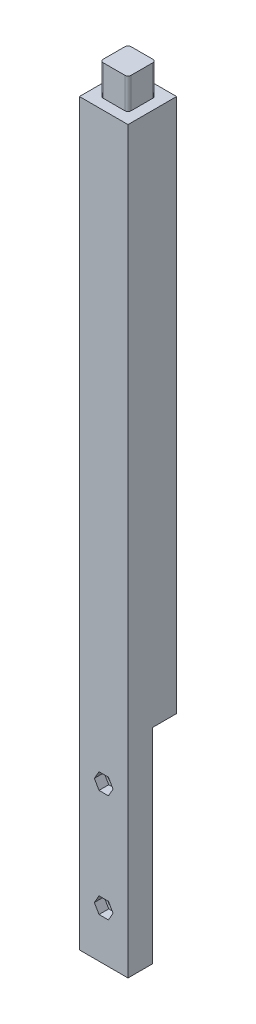
ISO-10303-21;
HEADER;
FILE_DESCRIPTION(('STEP AP214'),'2;1');
FILE_NAME('part.step','',(''),(''),'','','');
FILE_SCHEMA(('AUTOMOTIVE_DESIGN { 1 0 10303 214 1 1 1 1 }'));
ENDSEC;
DATA;
#1=APPLICATION_CONTEXT('core data for automotive mechanical design processes');
#2=APPLICATION_PROTOCOL_DEFINITION('international standard','automotive_design',2000,#1);
#3=PRODUCT_CONTEXT('',#1,'mechanical');
#4=PRODUCT('Part','Part','',(#3));
#5=PRODUCT_RELATED_PRODUCT_CATEGORY('part','',(#4));
#6=PRODUCT_DEFINITION_FORMATION('','',#4);
#7=PRODUCT_DEFINITION_CONTEXT('part definition',#1,'design');
#8=PRODUCT_DEFINITION('design','',#6,#7);
#9=PRODUCT_DEFINITION_SHAPE('','',#8);
#10=(LENGTH_UNIT() NAMED_UNIT(*) SI_UNIT(.MILLI.,.METRE.));
#11=(NAMED_UNIT(*) PLANE_ANGLE_UNIT() SI_UNIT($,.RADIAN.));
#12=(NAMED_UNIT(*) SI_UNIT($,.STERADIAN.) SOLID_ANGLE_UNIT());
#13=UNCERTAINTY_MEASURE_WITH_UNIT(LENGTH_MEASURE(1.E-05),#10,'distance_accuracy_value','');
#14=(GEOMETRIC_REPRESENTATION_CONTEXT(3) GLOBAL_UNCERTAINTY_ASSIGNED_CONTEXT((#13)) GLOBAL_UNIT_ASSIGNED_CONTEXT((#10,
#11,#12)) REPRESENTATION_CONTEXT('',''));
#15=CARTESIAN_POINT('',(0.,0.,0.));
#16=DIRECTION('',(0.,0.,1.));
#17=DIRECTION('',(1.,0.,0.));
#18=AXIS2_PLACEMENT_3D('',#15,#16,#17);
#19=CARTESIAN_POINT('',(-22.5,-95.0000000000001,42.3497474683057));
#20=DIRECTION('',(0.,0.,-1.));
#21=DIRECTION('',(-1.,0.,0.));
#22=AXIS2_PLACEMENT_3D('',#19,#20,#21);
#23=CYLINDRICAL_SURFACE('',#22,1.74999999999998);
#24=CARTESIAN_POINT('',(-22.5,-95.0000000000001,-99.9));
#25=DIRECTION('',(0.,0.,-1.));
#26=DIRECTION('',(-1.,0.,0.));
#27=AXIS2_PLACEMENT_3D('',#24,#25,#26);
#28=CIRCLE('',#27,1.74999999999998);
#29=CARTESIAN_POINT('',(-24.25,-95.0000000000001,-99.9));
#30=VERTEX_POINT('',#29);
#31=EDGE_CURVE('E351',#30,#30,#28,.T.);
#32=ORIENTED_EDGE('',*,*,#31,.T.);
#33=EDGE_LOOP('',(#32));
#34=FACE_BOUND('',#33,.T.);
#35=CARTESIAN_POINT('',(-22.5,-95.0000000000001,-95.4));
#36=DIRECTION('',(0.,0.,1.));
#37=DIRECTION('',(1.,0.,0.));
#38=AXIS2_PLACEMENT_3D('',#35,#36,#37);
#39=CIRCLE('',#38,1.74999999999998);
#40=CARTESIAN_POINT('',(-20.75,-95.0000000000001,-95.4));
#41=VERTEX_POINT('',#40);
#42=EDGE_CURVE('E41',#41,#41,#39,.F.);
#43=ORIENTED_EDGE('',*,*,#42,.F.);
#44=EDGE_LOOP('',(#43));
#45=FACE_BOUND('',#44,.T.);
#46=ADVANCED_FACE('F37',(#34,#45),#23,.F.);
#47=CARTESIAN_POINT('',(-22.5,-128.191488077077,42.3497474683057));
#48=DIRECTION('',(0.,0.,-1.));
#49=DIRECTION('',(-1.,0.,0.));
#50=AXIS2_PLACEMENT_3D('',#47,#48,#49);
#51=CYLINDRICAL_SURFACE('',#50,1.74999999999998);
#52=CARTESIAN_POINT('',(-22.5,-128.191488077077,-99.9));
#53=DIRECTION('',(0.,0.,-1.));
#54=DIRECTION('',(-1.,0.,0.));
#55=AXIS2_PLACEMENT_3D('',#52,#53,#54);
#56=CIRCLE('',#55,1.74999999999998);
#57=CARTESIAN_POINT('',(-24.25,-128.191488077077,-99.9));
#58=VERTEX_POINT('',#57);
#59=EDGE_CURVE('E355',#58,#58,#56,.T.);
#60=ORIENTED_EDGE('',*,*,#59,.T.);
#61=EDGE_LOOP('',(#60));
#62=FACE_BOUND('',#61,.T.);
#63=CARTESIAN_POINT('',(-22.5,-128.191488077077,-95.4));
#64=DIRECTION('',(0.,0.,1.));
#65=DIRECTION('',(1.,0.,0.));
#66=AXIS2_PLACEMENT_3D('',#63,#64,#65);
#67=CIRCLE('',#66,1.74999999999998);
#68=CARTESIAN_POINT('',(-20.75,-128.191488077077,-95.4));
#69=VERTEX_POINT('',#68);
#70=EDGE_CURVE('E276',#69,#69,#67,.F.);
#71=ORIENTED_EDGE('',*,*,#70,.F.);
#72=EDGE_LOOP('',(#71));
#73=FACE_BOUND('',#72,.T.);
#74=ADVANCED_FACE('F519',(#62,#73),#51,.F.);
#75=CARTESIAN_POINT('',(360.01,-143.191488077077,-99.9));
#76=DIRECTION('',(0.,-1.,0.));
#77=DIRECTION('',(0.,0.,-1.));
#78=AXIS2_PLACEMENT_3D('',#75,#76,#77);
#79=PLANE('',#78);
#80=DIRECTION('',(0.,0.,-1.));
#81=VECTOR('',#80,1.);
#82=CARTESIAN_POINT('',(-15.,-143.191488077077,-107.4));
#83=LINE('',#82,#81);
#84=CARTESIAN_POINT('',(-15.,-143.191488077077,-92.4));
#85=VERTEX_POINT('',#84);
#86=CARTESIAN_POINT('',(-15.,-143.191488077077,-99.9));
#87=VERTEX_POINT('',#86);
#88=EDGE_CURVE('E468',#85,#87,#83,.T.);
#89=ORIENTED_EDGE('',*,*,#88,.F.);
#90=DIRECTION('',(1.,0.,0.));
#91=VECTOR('',#90,1.);
#92=CARTESIAN_POINT('',(-15.,-143.191488077077,-92.4));
#93=LINE('',#92,#91);
#94=CARTESIAN_POINT('',(-30.,-143.191488077077,-92.4));
#95=VERTEX_POINT('',#94);
#96=EDGE_CURVE('E480',#95,#85,#93,.T.);
#97=ORIENTED_EDGE('',*,*,#96,.F.);
#98=DIRECTION('',(0.,0.,1.));
#99=VECTOR('',#98,1.);
#100=CARTESIAN_POINT('',(-30.,-143.191488077077,-107.4));
#101=LINE('',#100,#99);
#102=CARTESIAN_POINT('',(-30.,-143.191488077077,-99.9));
#103=VERTEX_POINT('',#102);
#104=EDGE_CURVE('E484',#103,#95,#101,.T.);
#105=ORIENTED_EDGE('',*,*,#104,.F.);
#106=DIRECTION('',(-1.,0.,0.));
#107=VECTOR('',#106,1.);
#108=CARTESIAN_POINT('',(360.01,-143.191488077077,-99.9));
#109=LINE('',#108,#107);
#110=EDGE_CURVE('E11',#87,#103,#109,.T.);
#111=ORIENTED_EDGE('',*,*,#110,.F.);
#112=EDGE_LOOP('',(#89,#97,#105,#111));
#113=FACE_BOUND('',#112,.T.);
#114=ADVANCED_FACE('F525',(#113),#79,.T.);
#115=CARTESIAN_POINT('',(360.01,-80.,-99.9));
#116=DIRECTION('',(0.,0.,-1.));
#117=DIRECTION('',(-1.,0.,0.));
#118=AXIS2_PLACEMENT_3D('',#115,#116,#117);
#119=PLANE('',#118);
#120=ORIENTED_EDGE('',*,*,#59,.F.);
#121=EDGE_LOOP('',(#120));
#122=FACE_BOUND('',#121,.T.);
#123=ORIENTED_EDGE('',*,*,#31,.F.);
#124=EDGE_LOOP('',(#123));
#125=FACE_BOUND('',#124,.T.);
#126=DIRECTION('',(0.,1.,0.));
#127=VECTOR('',#126,1.);
#128=CARTESIAN_POINT('',(-15.,-349.404691512674,-99.9));
#129=LINE('',#128,#127);
#130=CARTESIAN_POINT('',(-15.,-80.,-99.9));
#131=VERTEX_POINT('',#130);
#132=EDGE_CURVE('E473',#87,#131,#129,.T.);
#133=ORIENTED_EDGE('',*,*,#132,.F.);
#134=ORIENTED_EDGE('',*,*,#110,.T.);
#135=DIRECTION('',(0.,-1.,0.));
#136=VECTOR('',#135,1.);
#137=CARTESIAN_POINT('',(-30.,-349.404691512674,-99.9));
#138=LINE('',#137,#136);
#139=CARTESIAN_POINT('',(-30.,-80.,-99.9));
#140=VERTEX_POINT('',#139);
#141=EDGE_CURVE('E488',#140,#103,#138,.T.);
#142=ORIENTED_EDGE('',*,*,#141,.F.);
#143=DIRECTION('',(-1.,0.,0.));
#144=VECTOR('',#143,1.);
#145=CARTESIAN_POINT('',(360.01,-80.,-99.9));
#146=LINE('',#145,#144);
#147=EDGE_CURVE('E47',#131,#140,#146,.T.);
#148=ORIENTED_EDGE('',*,*,#147,.F.);
#149=EDGE_LOOP('',(#133,#134,#142,#148));
#150=FACE_BOUND('',#149,.T.);
#151=ADVANCED_FACE('F576',(#122,#125,#150),#119,.T.);
#152=CARTESIAN_POINT('',(360.01,-80.,-107.4));
#153=DIRECTION('',(0.,-1.,0.));
#154=DIRECTION('',(0.,0.,-1.));
#155=AXIS2_PLACEMENT_3D('',#152,#153,#154);
#156=PLANE('',#155);
#157=DIRECTION('',(0.,0.,-1.));
#158=VECTOR('',#157,1.);
#159=CARTESIAN_POINT('',(-15.,-80.,-107.4));
#160=LINE('',#159,#158);
#161=CARTESIAN_POINT('',(-15.,-80.0000000000001,-107.4));
#162=VERTEX_POINT('',#161);
#163=EDGE_CURVE('E477',#131,#162,#160,.T.);
#164=ORIENTED_EDGE('',*,*,#163,.F.);
#165=ORIENTED_EDGE('',*,*,#147,.T.);
#166=DIRECTION('',(0.,0.,1.));
#167=VECTOR('',#166,1.);
#168=CARTESIAN_POINT('',(-30.,-80.,-107.4));
#169=LINE('',#168,#167);
#170=CARTESIAN_POINT('',(-30.,-80.0000000000001,-107.4));
#171=VERTEX_POINT('',#170);
#172=EDGE_CURVE('E492',#171,#140,#169,.T.);
#173=ORIENTED_EDGE('',*,*,#172,.F.);
#174=DIRECTION('',(-1.,0.,0.));
#175=VECTOR('',#174,1.);
#176=CARTESIAN_POINT('',(-15.,-80.,-107.4));
#177=LINE('',#176,#175);
#178=EDGE_CURVE('E359',#162,#171,#177,.T.);
#179=ORIENTED_EDGE('',*,*,#178,.F.);
#180=EDGE_LOOP('',(#164,#165,#173,#179));
#181=FACE_BOUND('',#180,.T.);
#182=ADVANCED_FACE('F572',(#181),#156,.T.);
#183=CARTESIAN_POINT('',(-25.8,94.5,-103.2));
#184=DIRECTION('',(0.,1.,0.));
#185=DIRECTION('',(0.,0.,1.));
#186=AXIS2_PLACEMENT_3D('',#183,#184,#185);
#187=PLANE('',#186);
#188=CARTESIAN_POINT('',(-25.8,94.5,-103.2));
#189=DIRECTION('',(0.,1.,0.));
#190=DIRECTION('',(0.,0.,1.));
#191=AXIS2_PLACEMENT_3D('',#188,#189,#190);
#192=CIRCLE('',#191,1.);
#193=CARTESIAN_POINT('',(-25.8,94.5,-104.2));
#194=VERTEX_POINT('',#193);
#195=CARTESIAN_POINT('',(-26.8,94.5,-103.2));
#196=VERTEX_POINT('',#195);
#197=EDGE_CURVE('E415',#194,#196,#192,.T.);
#198=ORIENTED_EDGE('',*,*,#197,.T.);
#199=DIRECTION('',(0.,0.,1.));
#200=VECTOR('',#199,1.);
#201=CARTESIAN_POINT('',(-26.8,94.5,-103.2));
#202=LINE('',#201,#200);
#203=CARTESIAN_POINT('',(-26.8,94.5,-96.6));
#204=VERTEX_POINT('',#203);
#205=EDGE_CURVE('E460',#196,#204,#202,.T.);
#206=ORIENTED_EDGE('',*,*,#205,.T.);
#207=CARTESIAN_POINT('',(-25.8,94.5,-96.6));
#208=DIRECTION('',(0.,1.,0.));
#209=DIRECTION('',(0.,0.,1.));
#210=AXIS2_PLACEMENT_3D('',#207,#208,#209);
#211=CIRCLE('',#210,1.);
#212=CARTESIAN_POINT('',(-25.8,94.5,-95.6));
#213=VERTEX_POINT('',#212);
#214=EDGE_CURVE('E457',#204,#213,#211,.T.);
#215=ORIENTED_EDGE('',*,*,#214,.T.);
#216=DIRECTION('',(1.,0.,0.));
#217=VECTOR('',#216,1.);
#218=CARTESIAN_POINT('',(-25.8,94.5,-95.6));
#219=LINE('',#218,#217);
#220=CARTESIAN_POINT('',(-19.2,94.5,-95.6));
#221=VERTEX_POINT('',#220);
#222=EDGE_CURVE('E454',#213,#221,#219,.T.);
#223=ORIENTED_EDGE('',*,*,#222,.T.);
#224=CARTESIAN_POINT('',(-19.2,94.5,-96.6));
#225=DIRECTION('',(0.,1.,0.));
#226=DIRECTION('',(0.,0.,1.));
#227=AXIS2_PLACEMENT_3D('',#224,#225,#226);
#228=CIRCLE('',#227,1.);
#229=CARTESIAN_POINT('',(-18.2,94.5,-96.6));
#230=VERTEX_POINT('',#229);
#231=EDGE_CURVE('E451',#221,#230,#228,.T.);
#232=ORIENTED_EDGE('',*,*,#231,.T.);
#233=DIRECTION('',(0.,0.,-1.));
#234=VECTOR('',#233,1.);
#235=CARTESIAN_POINT('',(-18.2,94.5,-96.6));
#236=LINE('',#235,#234);
#237=CARTESIAN_POINT('',(-18.2,94.5,-103.2));
#238=VERTEX_POINT('',#237);
#239=EDGE_CURVE('E448',#230,#238,#236,.T.);
#240=ORIENTED_EDGE('',*,*,#239,.T.);
#241=CARTESIAN_POINT('',(-19.2,94.5,-103.2));
#242=DIRECTION('',(0.,1.,0.));
#243=DIRECTION('',(0.,0.,-1.));
#244=AXIS2_PLACEMENT_3D('',#241,#242,#243);
#245=CIRCLE('',#244,1.);
#246=CARTESIAN_POINT('',(-19.2,94.5,-104.2));
#247=VERTEX_POINT('',#246);
#248=EDGE_CURVE('E445',#238,#247,#245,.T.);
#249=ORIENTED_EDGE('',*,*,#248,.T.);
#250=DIRECTION('',(-1.,0.,0.));
#251=VECTOR('',#250,1.);
#252=CARTESIAN_POINT('',(-19.2,94.5,-104.2));
#253=LINE('',#252,#251);
#254=EDGE_CURVE('E409',#247,#194,#253,.T.);
#255=ORIENTED_EDGE('',*,*,#254,.T.);
#256=EDGE_LOOP('',(#198,#206,#215,#223,#232,#240,#249,#255));
#257=FACE_BOUND('',#256,.T.);
#258=ADVANCED_FACE('F528',(#257),#187,.T.);
#259=CARTESIAN_POINT('',(-26.8,94.5,-103.2));
#260=DIRECTION('',(1.,0.,0.));
#261=DIRECTION('',(0.,0.,-1.));
#262=AXIS2_PLACEMENT_3D('',#259,#260,#261);
#263=PLANE('',#262);
#264=DIRECTION('',(0.,0.,1.));
#265=VECTOR('',#264,1.);
#266=CARTESIAN_POINT('',(-26.8,85.,-103.2));
#267=LINE('',#266,#265);
#268=CARTESIAN_POINT('',(-26.8,85.,-103.2));
#269=VERTEX_POINT('',#268);
#270=CARTESIAN_POINT('',(-26.8,85.,-96.6));
#271=VERTEX_POINT('',#270);
#272=EDGE_CURVE('E435',#269,#271,#267,.T.);
#273=ORIENTED_EDGE('',*,*,#272,.T.);
#274=DIRECTION('',(0.,-1.,0.));
#275=VECTOR('',#274,1.);
#276=CARTESIAN_POINT('',(-26.8,94.5,-96.6));
#277=LINE('',#276,#275);
#278=EDGE_CURVE('E381',#204,#271,#277,.T.);
#279=ORIENTED_EDGE('',*,*,#278,.F.);
#280=ORIENTED_EDGE('',*,*,#205,.F.);
#281=DIRECTION('',(0.,-1.,0.));
#282=VECTOR('',#281,1.);
#283=CARTESIAN_POINT('',(-26.8,94.5,-103.2));
#284=LINE('',#283,#282);
#285=EDGE_CURVE('E364',#196,#269,#284,.T.);
#286=ORIENTED_EDGE('',*,*,#285,.T.);
#287=EDGE_LOOP('',(#273,#279,#280,#286));
#288=FACE_BOUND('',#287,.T.);
#289=ADVANCED_FACE('F543',(#288),#263,.F.);
#290=CARTESIAN_POINT('',(-25.8,94.5,-96.6));
#291=DIRECTION('',(0.,-1.,0.));
#292=DIRECTION('',(0.,0.,-1.));
#293=AXIS2_PLACEMENT_3D('',#290,#291,#292);
#294=CYLINDRICAL_SURFACE('',#293,1.);
#295=CARTESIAN_POINT('',(-25.8,85.,-96.6));
#296=DIRECTION('',(0.,1.,0.));
#297=DIRECTION('',(0.,0.,1.));
#298=AXIS2_PLACEMENT_3D('',#295,#296,#297);
#299=CIRCLE('',#298,1.);
#300=CARTESIAN_POINT('',(-25.8,85.,-95.6));
#301=VERTEX_POINT('',#300);
#302=EDGE_CURVE('E431',#271,#301,#299,.T.);
#303=ORIENTED_EDGE('',*,*,#302,.T.);
#304=DIRECTION('',(0.,-1.,0.));
#305=VECTOR('',#304,1.);
#306=CARTESIAN_POINT('',(-25.8,94.5,-95.6));
#307=LINE('',#306,#305);
#308=EDGE_CURVE('E385',#213,#301,#307,.T.);
#309=ORIENTED_EDGE('',*,*,#308,.F.);
#310=ORIENTED_EDGE('',*,*,#214,.F.);
#311=ORIENTED_EDGE('',*,*,#278,.T.);
#312=EDGE_LOOP('',(#303,#309,#310,#311));
#313=FACE_BOUND('',#312,.T.);
#314=ADVANCED_FACE('F546',(#313),#294,.T.);
#315=CARTESIAN_POINT('',(-25.8,94.5,-95.6));
#316=DIRECTION('',(0.,0.,-1.));
#317=DIRECTION('',(-1.,0.,0.));
#318=AXIS2_PLACEMENT_3D('',#315,#316,#317);
#319=PLANE('',#318);
#320=DIRECTION('',(1.,0.,0.));
#321=VECTOR('',#320,1.);
#322=CARTESIAN_POINT('',(-25.8,85.,-95.6));
#323=LINE('',#322,#321);
#324=CARTESIAN_POINT('',(-19.2,85.,-95.6));
#325=VERTEX_POINT('',#324);
#326=EDGE_CURVE('E427',#301,#325,#323,.T.);
#327=ORIENTED_EDGE('',*,*,#326,.T.);
#328=DIRECTION('',(0.,-1.,0.));
#329=VECTOR('',#328,1.);
#330=CARTESIAN_POINT('',(-19.2,94.5,-95.6));
#331=LINE('',#330,#329);
#332=EDGE_CURVE('E389',#221,#325,#331,.T.);
#333=ORIENTED_EDGE('',*,*,#332,.F.);
#334=ORIENTED_EDGE('',*,*,#222,.F.);
#335=ORIENTED_EDGE('',*,*,#308,.T.);
#336=EDGE_LOOP('',(#327,#333,#334,#335));
#337=FACE_BOUND('',#336,.T.);
#338=ADVANCED_FACE('F550',(#337),#319,.F.);
#339=CARTESIAN_POINT('',(-19.2,94.5,-96.6));
#340=DIRECTION('',(0.,-1.,0.));
#341=DIRECTION('',(0.,0.,-1.));
#342=AXIS2_PLACEMENT_3D('',#339,#340,#341);
#343=CYLINDRICAL_SURFACE('',#342,1.);
#344=CARTESIAN_POINT('',(-19.2,85.,-96.6));
#345=DIRECTION('',(0.,1.,0.));
#346=DIRECTION('',(0.,0.,1.));
#347=AXIS2_PLACEMENT_3D('',#344,#345,#346);
#348=CIRCLE('',#347,1.);
#349=CARTESIAN_POINT('',(-18.2,85.,-96.6));
#350=VERTEX_POINT('',#349);
#351=EDGE_CURVE('E423',#325,#350,#348,.T.);
#352=ORIENTED_EDGE('',*,*,#351,.T.);
#353=DIRECTION('',(0.,-1.,0.));
#354=VECTOR('',#353,1.);
#355=CARTESIAN_POINT('',(-18.2,94.5,-96.6));
#356=LINE('',#355,#354);
#357=EDGE_CURVE('E393',#230,#350,#356,.T.);
#358=ORIENTED_EDGE('',*,*,#357,.F.);
#359=ORIENTED_EDGE('',*,*,#231,.F.);
#360=ORIENTED_EDGE('',*,*,#332,.T.);
#361=EDGE_LOOP('',(#352,#358,#359,#360));
#362=FACE_BOUND('',#361,.T.);
#363=ADVANCED_FACE('F554',(#362),#343,.T.);
#364=CARTESIAN_POINT('',(-18.2,94.5,-96.6));
#365=DIRECTION('',(-1.,0.,0.));
#366=DIRECTION('',(0.,0.,1.));
#367=AXIS2_PLACEMENT_3D('',#364,#365,#366);
#368=PLANE('',#367);
#369=DIRECTION('',(0.,0.,-1.));
#370=VECTOR('',#369,1.);
#371=CARTESIAN_POINT('',(-18.2,85.,-96.6));
#372=LINE('',#371,#370);
#373=CARTESIAN_POINT('',(-18.2,85.,-103.2));
#374=VERTEX_POINT('',#373);
#375=EDGE_CURVE('E419',#350,#374,#372,.T.);
#376=ORIENTED_EDGE('',*,*,#375,.T.);
#377=DIRECTION('',(0.,-1.,0.));
#378=VECTOR('',#377,1.);
#379=CARTESIAN_POINT('',(-18.2,94.5,-103.2));
#380=LINE('',#379,#378);
#381=EDGE_CURVE('E397',#238,#374,#380,.T.);
#382=ORIENTED_EDGE('',*,*,#381,.F.);
#383=ORIENTED_EDGE('',*,*,#239,.F.);
#384=ORIENTED_EDGE('',*,*,#357,.T.);
#385=EDGE_LOOP('',(#376,#382,#383,#384));
#386=FACE_BOUND('',#385,.T.);
#387=ADVANCED_FACE('F558',(#386),#368,.F.);
#388=CARTESIAN_POINT('',(-19.2,94.5,-103.2));
#389=DIRECTION('',(0.,-1.,0.));
#390=DIRECTION('',(0.,0.,-1.));
#391=AXIS2_PLACEMENT_3D('',#388,#389,#390);
#392=CYLINDRICAL_SURFACE('',#391,1.);
#393=CARTESIAN_POINT('',(-19.2,85.,-103.2));
#394=DIRECTION('',(0.,1.,0.));
#395=DIRECTION('',(0.,0.,-1.));
#396=AXIS2_PLACEMENT_3D('',#393,#394,#395);
#397=CIRCLE('',#396,1.);
#398=CARTESIAN_POINT('',(-19.2,85.,-104.2));
#399=VERTEX_POINT('',#398);
#400=EDGE_CURVE('E414',#374,#399,#397,.T.);
#401=ORIENTED_EDGE('',*,*,#400,.T.);
#402=DIRECTION('',(0.,-1.,0.));
#403=VECTOR('',#402,1.);
#404=CARTESIAN_POINT('',(-19.2,94.5,-104.2));
#405=LINE('',#404,#403);
#406=EDGE_CURVE('E401',#247,#399,#405,.T.);
#407=ORIENTED_EDGE('',*,*,#406,.F.);
#408=ORIENTED_EDGE('',*,*,#248,.F.);
#409=ORIENTED_EDGE('',*,*,#381,.T.);
#410=EDGE_LOOP('',(#401,#407,#408,#409));
#411=FACE_BOUND('',#410,.T.);
#412=ADVANCED_FACE('F562',(#411),#392,.T.);
#413=CARTESIAN_POINT('',(-19.2,94.5,-104.2));
#414=DIRECTION('',(0.,0.,1.));
#415=DIRECTION('',(1.,0.,0.));
#416=AXIS2_PLACEMENT_3D('',#413,#414,#415);
#417=PLANE('',#416);
#418=DIRECTION('',(-1.,0.,0.));
#419=VECTOR('',#418,1.);
#420=CARTESIAN_POINT('',(-19.2,85.,-104.2));
#421=LINE('',#420,#419);
#422=CARTESIAN_POINT('',(-25.8,85.,-104.2));
#423=VERTEX_POINT('',#422);
#424=EDGE_CURVE('E410',#399,#423,#421,.T.);
#425=ORIENTED_EDGE('',*,*,#424,.T.);
#426=DIRECTION('',(0.,-1.,0.));
#427=VECTOR('',#426,1.);
#428=CARTESIAN_POINT('',(-25.8,94.5,-104.2));
#429=LINE('',#428,#427);
#430=EDGE_CURVE('E405',#194,#423,#429,.T.);
#431=ORIENTED_EDGE('',*,*,#430,.F.);
#432=ORIENTED_EDGE('',*,*,#254,.F.);
#433=ORIENTED_EDGE('',*,*,#406,.T.);
#434=EDGE_LOOP('',(#425,#431,#432,#433));
#435=FACE_BOUND('',#434,.T.);
#436=ADVANCED_FACE('F541',(#435),#417,.F.);
#437=CARTESIAN_POINT('',(-25.8,94.5,-103.2));
#438=DIRECTION('',(0.,-1.,0.));
#439=DIRECTION('',(0.,0.,-1.));
#440=AXIS2_PLACEMENT_3D('',#437,#438,#439);
#441=CYLINDRICAL_SURFACE('',#440,1.);
#442=CARTESIAN_POINT('',(-25.8,85.,-103.2));
#443=DIRECTION('',(0.,1.,0.));
#444=DIRECTION('',(0.,0.,1.));
#445=AXIS2_PLACEMENT_3D('',#442,#443,#444);
#446=CIRCLE('',#445,1.);
#447=EDGE_CURVE('E439',#423,#269,#446,.T.);
#448=ORIENTED_EDGE('',*,*,#447,.T.);
#449=ORIENTED_EDGE('',*,*,#285,.F.);
#450=ORIENTED_EDGE('',*,*,#197,.F.);
#451=ORIENTED_EDGE('',*,*,#430,.T.);
#452=EDGE_LOOP('',(#448,#449,#450,#451));
#453=FACE_BOUND('',#452,.T.);
#454=ADVANCED_FACE('F537',(#453),#441,.T.);
#455=CARTESIAN_POINT('',(-30.,-349.404691512674,-107.4));
#456=DIRECTION('',(-1.,0.,0.));
#457=DIRECTION('',(0.,0.,1.));
#458=AXIS2_PLACEMENT_3D('',#455,#456,#457);
#459=PLANE('',#458);
#460=DIRECTION('',(0.,1.,0.));
#461=VECTOR('',#460,1.);
#462=CARTESIAN_POINT('',(-30.,-349.404691512674,-107.4));
#463=LINE('',#462,#461);
#464=CARTESIAN_POINT('',(-30.,85.,-107.4));
#465=VERTEX_POINT('',#464);
#466=EDGE_CURVE('E371',#171,#465,#463,.T.);
#467=ORIENTED_EDGE('',*,*,#466,.F.);
#468=ORIENTED_EDGE('',*,*,#172,.T.);
#469=ORIENTED_EDGE('',*,*,#141,.T.);
#470=ORIENTED_EDGE('',*,*,#104,.T.);
#471=DIRECTION('',(0.,1.,0.));
#472=VECTOR('',#471,1.);
#473=CARTESIAN_POINT('',(-30.,-349.404691512674,-92.4));
#474=LINE('',#473,#472);
#475=CARTESIAN_POINT('',(-30.,85.,-92.4));
#476=VERTEX_POINT('',#475);
#477=EDGE_CURVE('E504',#95,#476,#474,.T.);
#478=ORIENTED_EDGE('',*,*,#477,.T.);
#479=DIRECTION('',(0.,0.,-1.));
#480=VECTOR('',#479,1.);
#481=CARTESIAN_POINT('',(-30.,85.,-107.4));
#482=LINE('',#481,#480);
#483=EDGE_CURVE('E365',#476,#465,#482,.T.);
#484=ORIENTED_EDGE('',*,*,#483,.T.);
#485=EDGE_LOOP('',(#467,#468,#469,#470,#478,#484));
#486=FACE_BOUND('',#485,.T.);
#487=ADVANCED_FACE('F540',(#486),#459,.T.);
#488=CARTESIAN_POINT('',(-15.,-349.404691512674,-92.4));
#489=DIRECTION('',(0.,0.,1.));
#490=DIRECTION('',(1.,0.,0.));
#491=AXIS2_PLACEMENT_3D('',#488,#489,#490);
#492=PLANE('',#491);
#493=DIRECTION('',(0.5,0.866025403784439,0.));
#494=VECTOR('',#493,1.);
#495=CARTESIAN_POINT('',(-38.6203993364982,-127.921350689115,-92.4));
#496=LINE('',#495,#494);
#497=CARTESIAN_POINT('',(-21.0566243270259,-97.5000000000001,-92.4));
#498=VERTEX_POINT('',#497);
#499=CARTESIAN_POINT('',(-19.6132486540519,-95.0000000000001,-92.4));
#500=VERTEX_POINT('',#499);
#501=EDGE_CURVE('E55',#498,#500,#496,.T.);
#502=ORIENTED_EDGE('',*,*,#501,.F.);
#503=DIRECTION('',(1.,0.,0.));
#504=VECTOR('',#503,1.);
#505=CARTESIAN_POINT('',(345.,-97.5000000000001,-92.4));
#506=LINE('',#505,#504);
#507=CARTESIAN_POINT('',(-23.9433756729741,-97.5000000000001,-92.4));
#508=VERTEX_POINT('',#507);
#509=EDGE_CURVE('E237',#508,#498,#506,.T.);
#510=ORIENTED_EDGE('',*,*,#509,.F.);
#511=DIRECTION('',(0.5,-0.866025403784439,0.));
#512=VECTOR('',#511,1.);
#513=CARTESIAN_POINT('',(177.370399336498,-446.185686579896,-92.4));
#514=LINE('',#513,#512);
#515=CARTESIAN_POINT('',(-25.3867513459482,-94.9999999999999,-92.4));
#516=VERTEX_POINT('',#515);
#517=EDGE_CURVE('E242',#516,#508,#514,.T.);
#518=ORIENTED_EDGE('',*,*,#517,.F.);
#519=DIRECTION('',(-0.5,-0.866025403784439,0.));
#520=VECTOR('',#519,1.);
#521=CARTESIAN_POINT('',(-42.9505263554206,-125.421350689115,-92.4));
#522=LINE('',#521,#520);
#523=CARTESIAN_POINT('',(-23.9433756729741,-92.5000000000001,-92.4));
#524=VERTEX_POINT('',#523);
#525=EDGE_CURVE('E266',#524,#516,#522,.T.);
#526=ORIENTED_EDGE('',*,*,#525,.F.);
#527=DIRECTION('',(-1.,0.,0.));
#528=VECTOR('',#527,1.);
#529=CARTESIAN_POINT('',(345.,-92.5000000000001,-92.4));
#530=LINE('',#529,#528);
#531=CARTESIAN_POINT('',(-21.0566243270259,-92.5000000000001,-92.4));
#532=VERTEX_POINT('',#531);
#533=EDGE_CURVE('E262',#532,#524,#530,.T.);
#534=ORIENTED_EDGE('',*,*,#533,.F.);
#535=DIRECTION('',(-0.5,0.866025403784439,0.));
#536=VECTOR('',#535,1.);
#537=CARTESIAN_POINT('',(181.70052635542,-443.685686579896,-92.4));
#538=LINE('',#537,#536);
#539=EDGE_CURVE('E258',#500,#532,#538,.T.);
#540=ORIENTED_EDGE('',*,*,#539,.F.);
#541=EDGE_LOOP('',(#502,#510,#518,#526,#534,#540));
#542=FACE_BOUND('',#541,.T.);
#543=DIRECTION('',(0.500000000000001,0.866025403784438,0.));
#544=VECTOR('',#543,1.);
#545=CARTESIAN_POINT('',(-24.2480634044195,-136.219222708384,-92.4));
#546=LINE('',#545,#544);
#547=CARTESIAN_POINT('',(-21.056624327026,-130.691488077077,-92.4));
#548=VERTEX_POINT('',#547);
#549=CARTESIAN_POINT('',(-19.613248654052,-128.191488077077,-92.4));
#550=VERTEX_POINT('',#549);
#551=EDGE_CURVE('E63',#548,#550,#546,.T.);
#552=ORIENTED_EDGE('',*,*,#551,.F.);
#553=DIRECTION('',(1.,0.,0.));
#554=VECTOR('',#553,1.);
#555=CARTESIAN_POINT('',(345.,-130.691488077077,-92.4));
#556=LINE('',#555,#554);
#557=CARTESIAN_POINT('',(-23.9433756729741,-130.691488077077,-92.4));
#558=VERTEX_POINT('',#557);
#559=EDGE_CURVE('E293',#558,#548,#556,.T.);
#560=ORIENTED_EDGE('',*,*,#559,.F.);
#561=DIRECTION('',(0.499999999999999,-0.866025403784439,0.));
#562=VECTOR('',#561,1.);
#563=CARTESIAN_POINT('',(162.998063404419,-454.483558599165,-92.4));
#564=LINE('',#563,#562);
#565=CARTESIAN_POINT('',(-25.3867513459482,-128.191488077077,-92.4));
#566=VERTEX_POINT('',#565);
#567=EDGE_CURVE('E328',#566,#558,#564,.T.);
#568=ORIENTED_EDGE('',*,*,#567,.F.);
#569=DIRECTION('',(-0.500000000000002,-0.866025403784438,0.));
#570=VECTOR('',#569,1.);
#571=CARTESIAN_POINT('',(-28.5781904233415,-133.719222708383,-92.4));
#572=LINE('',#571,#570);
#573=CARTESIAN_POINT('',(-23.9433756729741,-125.691488077077,-92.4));
#574=VERTEX_POINT('',#573);
#575=EDGE_CURVE('E324',#574,#566,#572,.T.);
#576=ORIENTED_EDGE('',*,*,#575,.F.);
#577=DIRECTION('',(-1.,0.,0.));
#578=VECTOR('',#577,1.);
#579=CARTESIAN_POINT('',(345.,-125.691488077077,-92.4));
#580=LINE('',#579,#578);
#581=CARTESIAN_POINT('',(-21.056624327026,-125.691488077077,-92.4));
#582=VERTEX_POINT('',#581);
#583=EDGE_CURVE('E320',#582,#574,#580,.T.);
#584=ORIENTED_EDGE('',*,*,#583,.F.);
#585=DIRECTION('',(-0.499999999999999,0.866025403784439,0.));
#586=VECTOR('',#585,1.);
#587=CARTESIAN_POINT('',(167.328190423341,-451.983558599165,-92.4));
#588=LINE('',#587,#586);
#589=EDGE_CURVE('E316',#550,#582,#588,.T.);
#590=ORIENTED_EDGE('',*,*,#589,.F.);
#591=EDGE_LOOP('',(#552,#560,#568,#576,#584,#590));
#592=FACE_BOUND('',#591,.T.);
#593=ORIENTED_EDGE('',*,*,#477,.F.);
#594=ORIENTED_EDGE('',*,*,#96,.T.);
#595=DIRECTION('',(0.,1.,0.));
#596=VECTOR('',#595,1.);
#597=CARTESIAN_POINT('',(-15.,-349.404691512674,-92.4));
#598=LINE('',#597,#596);
#599=CARTESIAN_POINT('',(-15.,85.,-92.4));
#600=VERTEX_POINT('',#599);
#601=EDGE_CURVE('E501',#85,#600,#598,.T.);
#602=ORIENTED_EDGE('',*,*,#601,.T.);
#603=DIRECTION('',(-1.,0.,0.));
#604=VECTOR('',#603,1.);
#605=CARTESIAN_POINT('',(-15.,85.,-92.4));
#606=LINE('',#605,#604);
#607=EDGE_CURVE('E360',#600,#476,#606,.T.);
#608=ORIENTED_EDGE('',*,*,#607,.T.);
#609=EDGE_LOOP('',(#593,#594,#602,#608));
#610=FACE_BOUND('',#609,.T.);
#611=ADVANCED_FACE('F535',(#542,#592,#610),#492,.T.);
#612=CARTESIAN_POINT('',(150.,85.,0.));
#613=DIRECTION('',(0.,-1.,0.));
#614=DIRECTION('',(0.,0.,-1.));
#615=AXIS2_PLACEMENT_3D('',#612,#613,#614);
#616=PLANE('',#615);
#617=DIRECTION('',(1.,0.,0.));
#618=VECTOR('',#617,1.);
#619=CARTESIAN_POINT('',(-15.,85.,-107.4));
#620=LINE('',#619,#618);
#621=CARTESIAN_POINT('',(-15.,85.,-107.4));
#622=VERTEX_POINT('',#621);
#623=EDGE_CURVE('E370',#465,#622,#620,.T.);
#624=ORIENTED_EDGE('',*,*,#623,.F.);
#625=ORIENTED_EDGE('',*,*,#483,.F.);
#626=ORIENTED_EDGE('',*,*,#607,.F.);
#627=DIRECTION('',(0.,0.,1.));
#628=VECTOR('',#627,1.);
#629=CARTESIAN_POINT('',(-15.,85.,-107.4));
#630=LINE('',#629,#628);
#631=EDGE_CURVE('E366',#622,#600,#630,.T.);
#632=ORIENTED_EDGE('',*,*,#631,.F.);
#633=EDGE_LOOP('',(#624,#625,#626,#632));
#634=FACE_BOUND('',#633,.T.);
#635=ORIENTED_EDGE('',*,*,#447,.F.);
#636=ORIENTED_EDGE('',*,*,#424,.F.);
#637=ORIENTED_EDGE('',*,*,#400,.F.);
#638=ORIENTED_EDGE('',*,*,#375,.F.);
#639=ORIENTED_EDGE('',*,*,#351,.F.);
#640=ORIENTED_EDGE('',*,*,#326,.F.);
#641=ORIENTED_EDGE('',*,*,#302,.F.);
#642=ORIENTED_EDGE('',*,*,#272,.F.);
#643=EDGE_LOOP('',(#635,#636,#637,#638,#639,#640,#641,#642));
#644=FACE_BOUND('',#643,.T.);
#645=ADVANCED_FACE('F531',(#634,#644),#616,.F.);
#646=CARTESIAN_POINT('',(-15.,-349.404691512674,-107.4));
#647=DIRECTION('',(0.,0.,-1.));
#648=DIRECTION('',(-1.,0.,0.));
#649=AXIS2_PLACEMENT_3D('',#646,#647,#648);
#650=PLANE('',#649);
#651=DIRECTION('',(0.,1.,0.));
#652=VECTOR('',#651,1.);
#653=CARTESIAN_POINT('',(-15.,-349.404691512674,-107.4));
#654=LINE('',#653,#652);
#655=EDGE_CURVE('E472',#162,#622,#654,.T.);
#656=ORIENTED_EDGE('',*,*,#655,.F.);
#657=ORIENTED_EDGE('',*,*,#178,.T.);
#658=ORIENTED_EDGE('',*,*,#466,.T.);
#659=ORIENTED_EDGE('',*,*,#623,.T.);
#660=EDGE_LOOP('',(#656,#657,#658,#659));
#661=FACE_BOUND('',#660,.T.);
#662=ADVANCED_FACE('F534',(#661),#650,.T.);
#663=CARTESIAN_POINT('',(-15.,-349.404691512674,-107.4));
#664=DIRECTION('',(1.,0.,0.));
#665=DIRECTION('',(0.,0.,-1.));
#666=AXIS2_PLACEMENT_3D('',#663,#664,#665);
#667=PLANE('',#666);
#668=ORIENTED_EDGE('',*,*,#132,.T.);
#669=ORIENTED_EDGE('',*,*,#163,.T.);
#670=ORIENTED_EDGE('',*,*,#655,.T.);
#671=ORIENTED_EDGE('',*,*,#631,.T.);
#672=ORIENTED_EDGE('',*,*,#601,.F.);
#673=ORIENTED_EDGE('',*,*,#88,.T.);
#674=EDGE_LOOP('',(#668,#669,#670,#671,#672,#673));
#675=FACE_BOUND('',#674,.T.);
#676=ADVANCED_FACE('F39',(#675),#667,.T.);
#677=CARTESIAN_POINT('',(0.,0.,-95.4));
#678=DIRECTION('',(0.,0.,1.));
#679=DIRECTION('',(1.,0.,0.));
#680=AXIS2_PLACEMENT_3D('',#677,#678,#679);
#681=PLANE('',#680);
#682=DIRECTION('',(0.500000000000001,0.866025403784438,0.));
#683=VECTOR('',#682,1.);
#684=CARTESIAN_POINT('',(-24.2480634044195,-136.219222708384,-95.4));
#685=LINE('',#684,#683);
#686=CARTESIAN_POINT('',(-21.056624327026,-130.691488077077,-95.4));
#687=VERTEX_POINT('',#686);
#688=CARTESIAN_POINT('',(-19.6132486540519,-128.191488077077,-95.4));
#689=VERTEX_POINT('',#688);
#690=EDGE_CURVE('E288',#687,#689,#685,.T.);
#691=ORIENTED_EDGE('',*,*,#690,.T.);
#692=DIRECTION('',(-0.499999999999999,0.866025403784439,0.));
#693=VECTOR('',#692,1.);
#694=CARTESIAN_POINT('',(167.328190423341,-451.983558599165,-95.4));
#695=LINE('',#694,#693);
#696=CARTESIAN_POINT('',(-21.056624327026,-125.691488077077,-95.4));
#697=VERTEX_POINT('',#696);
#698=EDGE_CURVE('E292',#689,#697,#695,.T.);
#699=ORIENTED_EDGE('',*,*,#698,.T.);
#700=DIRECTION('',(-1.,0.,0.));
#701=VECTOR('',#700,1.);
#702=CARTESIAN_POINT('',(345.,-125.691488077077,-95.4));
#703=LINE('',#702,#701);
#704=CARTESIAN_POINT('',(-23.9433756729741,-125.691488077077,-95.4));
#705=VERTEX_POINT('',#704);
#706=EDGE_CURVE('E297',#697,#705,#703,.T.);
#707=ORIENTED_EDGE('',*,*,#706,.T.);
#708=DIRECTION('',(-0.500000000000002,-0.866025403784438,0.));
#709=VECTOR('',#708,1.);
#710=CARTESIAN_POINT('',(-28.5781904233415,-133.719222708383,-95.4));
#711=LINE('',#710,#709);
#712=CARTESIAN_POINT('',(-25.3867513459482,-128.191488077077,-95.4));
#713=VERTEX_POINT('',#712);
#714=EDGE_CURVE('E301',#705,#713,#711,.T.);
#715=ORIENTED_EDGE('',*,*,#714,.T.);
#716=DIRECTION('',(0.499999999999999,-0.866025403784439,0.));
#717=VECTOR('',#716,1.);
#718=CARTESIAN_POINT('',(162.998063404419,-454.483558599165,-95.4));
#719=LINE('',#718,#717);
#720=CARTESIAN_POINT('',(-23.9433756729741,-130.691488077077,-95.4));
#721=VERTEX_POINT('',#720);
#722=EDGE_CURVE('E305',#713,#721,#719,.T.);
#723=ORIENTED_EDGE('',*,*,#722,.T.);
#724=DIRECTION('',(1.,0.,0.));
#725=VECTOR('',#724,1.);
#726=CARTESIAN_POINT('',(345.,-130.691488077077,-95.4));
#727=LINE('',#726,#725);
#728=EDGE_CURVE('E309',#721,#687,#727,.T.);
#729=ORIENTED_EDGE('',*,*,#728,.T.);
#730=EDGE_LOOP('',(#691,#699,#707,#715,#723,#729));
#731=FACE_BOUND('',#730,.T.);
#732=ORIENTED_EDGE('',*,*,#70,.T.);
#733=EDGE_LOOP('',(#732));
#734=FACE_BOUND('',#733,.T.);
#735=ADVANCED_FACE('F578',(#731,#734),#681,.T.);
#736=CARTESIAN_POINT('',(-24.2480634044195,-136.219222708384,-95.4));
#737=DIRECTION('',(0.866025403784438,-0.500000000000001,0.));
#738=DIRECTION('',(0.500000000000001,0.866025403784438,0.));
#739=AXIS2_PLACEMENT_3D('',#736,#737,#738);
#740=PLANE('',#739);
#741=ORIENTED_EDGE('',*,*,#551,.T.);
#742=DIRECTION('',(0.,0.,1.));
#743=VECTOR('',#742,1.);
#744=CARTESIAN_POINT('',(-19.6132486540519,-128.191488077077,-95.4));
#745=LINE('',#744,#743);
#746=EDGE_CURVE('E313',#689,#550,#745,.T.);
#747=ORIENTED_EDGE('',*,*,#746,.F.);
#748=ORIENTED_EDGE('',*,*,#690,.F.);
#749=DIRECTION('',(0.,0.,1.));
#750=VECTOR('',#749,1.);
#751=CARTESIAN_POINT('',(-21.056624327026,-130.691488077077,-95.4));
#752=LINE('',#751,#750);
#753=EDGE_CURVE('E259',#687,#548,#752,.T.);
#754=ORIENTED_EDGE('',*,*,#753,.T.);
#755=EDGE_LOOP('',(#741,#747,#748,#754));
#756=FACE_BOUND('',#755,.T.);
#757=ADVANCED_FACE('F619',(#756),#740,.F.);
#758=CARTESIAN_POINT('',(345.,-130.691488077077,-95.4));
#759=DIRECTION('',(0.,-1.,0.));
#760=DIRECTION('',(0.,0.,-1.));
#761=AXIS2_PLACEMENT_3D('',#758,#759,#760);
#762=PLANE('',#761);
#763=ORIENTED_EDGE('',*,*,#559,.T.);
#764=ORIENTED_EDGE('',*,*,#753,.F.);
#765=ORIENTED_EDGE('',*,*,#728,.F.);
#766=DIRECTION('',(0.,0.,1.));
#767=VECTOR('',#766,1.);
#768=CARTESIAN_POINT('',(-23.9433756729741,-130.691488077077,-95.4));
#769=LINE('',#768,#767);
#770=EDGE_CURVE('E337',#721,#558,#769,.T.);
#771=ORIENTED_EDGE('',*,*,#770,.T.);
#772=EDGE_LOOP('',(#763,#764,#765,#771));
#773=FACE_BOUND('',#772,.T.);
#774=ADVANCED_FACE('F625',(#773),#762,.F.);
#775=CARTESIAN_POINT('',(162.998063404419,-454.483558599165,-95.4));
#776=DIRECTION('',(-0.866025403784439,-0.499999999999999,0.));
#777=DIRECTION('',(0.499999999999999,-0.866025403784439,0.));
#778=AXIS2_PLACEMENT_3D('',#775,#776,#777);
#779=PLANE('',#778);
#780=ORIENTED_EDGE('',*,*,#567,.T.);
#781=ORIENTED_EDGE('',*,*,#770,.F.);
#782=ORIENTED_EDGE('',*,*,#722,.F.);
#783=DIRECTION('',(0.,0.,1.));
#784=VECTOR('',#783,1.);
#785=CARTESIAN_POINT('',(-25.3867513459482,-128.191488077077,-95.4));
#786=LINE('',#785,#784);
#787=EDGE_CURVE('E340',#713,#566,#786,.T.);
#788=ORIENTED_EDGE('',*,*,#787,.T.);
#789=EDGE_LOOP('',(#780,#781,#782,#788));
#790=FACE_BOUND('',#789,.T.);
#791=ADVANCED_FACE('F631',(#790),#779,.F.);
#792=CARTESIAN_POINT('',(-28.5781904233415,-133.719222708383,-95.4));
#793=DIRECTION('',(-0.866025403784438,0.500000000000002,0.));
#794=DIRECTION('',(-0.500000000000002,-0.866025403784438,0.));
#795=AXIS2_PLACEMENT_3D('',#792,#793,#794);
#796=PLANE('',#795);
#797=ORIENTED_EDGE('',*,*,#575,.T.);
#798=ORIENTED_EDGE('',*,*,#787,.F.);
#799=ORIENTED_EDGE('',*,*,#714,.F.);
#800=DIRECTION('',(0.,0.,1.));
#801=VECTOR('',#800,1.);
#802=CARTESIAN_POINT('',(-23.9433756729741,-125.691488077077,-95.4));
#803=LINE('',#802,#801);
#804=EDGE_CURVE('E343',#705,#574,#803,.T.);
#805=ORIENTED_EDGE('',*,*,#804,.T.);
#806=EDGE_LOOP('',(#797,#798,#799,#805));
#807=FACE_BOUND('',#806,.T.);
#808=ADVANCED_FACE('F635',(#807),#796,.F.);
#809=CARTESIAN_POINT('',(345.,-125.691488077077,-95.4));
#810=DIRECTION('',(0.,1.,0.));
#811=DIRECTION('',(0.,0.,1.));
#812=AXIS2_PLACEMENT_3D('',#809,#810,#811);
#813=PLANE('',#812);
#814=ORIENTED_EDGE('',*,*,#583,.T.);
#815=ORIENTED_EDGE('',*,*,#804,.F.);
#816=ORIENTED_EDGE('',*,*,#706,.F.);
#817=DIRECTION('',(0.,0.,1.));
#818=VECTOR('',#817,1.);
#819=CARTESIAN_POINT('',(-21.056624327026,-125.691488077077,-95.4));
#820=LINE('',#819,#818);
#821=EDGE_CURVE('E346',#697,#582,#820,.T.);
#822=ORIENTED_EDGE('',*,*,#821,.T.);
#823=EDGE_LOOP('',(#814,#815,#816,#822));
#824=FACE_BOUND('',#823,.T.);
#825=ADVANCED_FACE('F639',(#824),#813,.F.);
#826=CARTESIAN_POINT('',(167.328190423341,-451.983558599165,-95.4));
#827=DIRECTION('',(0.866025403784439,0.499999999999999,0.));
#828=DIRECTION('',(-0.499999999999999,0.866025403784439,0.));
#829=AXIS2_PLACEMENT_3D('',#826,#827,#828);
#830=PLANE('',#829);
#831=ORIENTED_EDGE('',*,*,#589,.T.);
#832=ORIENTED_EDGE('',*,*,#821,.F.);
#833=ORIENTED_EDGE('',*,*,#698,.F.);
#834=ORIENTED_EDGE('',*,*,#746,.T.);
#835=EDGE_LOOP('',(#831,#832,#833,#834));
#836=FACE_BOUND('',#835,.T.);
#837=ADVANCED_FACE('F643',(#836),#830,.F.);
#838=CARTESIAN_POINT('',(0.,0.,-95.4));
#839=DIRECTION('',(0.,0.,1.));
#840=DIRECTION('',(1.,0.,0.));
#841=AXIS2_PLACEMENT_3D('',#838,#839,#840);
#842=PLANE('',#841);
#843=DIRECTION('',(0.5,0.866025403784439,0.));
#844=VECTOR('',#843,1.);
#845=CARTESIAN_POINT('',(-38.6203993364982,-127.921350689115,-95.4));
#846=LINE('',#845,#844);
#847=CARTESIAN_POINT('',(-21.0566243270259,-97.5000000000001,-95.4));
#848=VERTEX_POINT('',#847);
#849=CARTESIAN_POINT('',(-19.6132486540519,-95.0000000000001,-95.4));
#850=VERTEX_POINT('',#849);
#851=EDGE_CURVE('E214',#848,#850,#846,.T.);
#852=ORIENTED_EDGE('',*,*,#851,.T.);
#853=DIRECTION('',(-0.5,0.866025403784439,0.));
#854=VECTOR('',#853,1.);
#855=CARTESIAN_POINT('',(181.70052635542,-443.685686579896,-95.4));
#856=LINE('',#855,#854);
#857=CARTESIAN_POINT('',(-21.0566243270259,-92.5000000000001,-95.4));
#858=VERTEX_POINT('',#857);
#859=EDGE_CURVE('E224',#850,#858,#856,.T.);
#860=ORIENTED_EDGE('',*,*,#859,.T.);
#861=DIRECTION('',(-1.,0.,0.));
#862=VECTOR('',#861,1.);
#863=CARTESIAN_POINT('',(345.,-92.5000000000001,-95.4));
#864=LINE('',#863,#862);
#865=CARTESIAN_POINT('',(-23.9433756729741,-92.5000000000001,-95.4));
#866=VERTEX_POINT('',#865);
#867=EDGE_CURVE('E230',#858,#866,#864,.T.);
#868=ORIENTED_EDGE('',*,*,#867,.T.);
#869=DIRECTION('',(-0.5,-0.866025403784439,0.));
#870=VECTOR('',#869,1.);
#871=CARTESIAN_POINT('',(-42.9505263554206,-125.421350689115,-95.4));
#872=LINE('',#871,#870);
#873=CARTESIAN_POINT('',(-25.3867513459482,-94.9999999999999,-95.4));
#874=VERTEX_POINT('',#873);
#875=EDGE_CURVE('E247',#866,#874,#872,.T.);
#876=ORIENTED_EDGE('',*,*,#875,.T.);
#877=DIRECTION('',(0.5,-0.866025403784439,0.));
#878=VECTOR('',#877,1.);
#879=CARTESIAN_POINT('',(177.370399336498,-446.185686579896,-95.4));
#880=LINE('',#879,#878);
#881=CARTESIAN_POINT('',(-23.9433756729741,-97.5000000000001,-95.4));
#882=VERTEX_POINT('',#881);
#883=EDGE_CURVE('E251',#874,#882,#880,.T.);
#884=ORIENTED_EDGE('',*,*,#883,.T.);
#885=DIRECTION('',(1.,0.,0.));
#886=VECTOR('',#885,1.);
#887=CARTESIAN_POINT('',(345.,-97.5000000000001,-95.4));
#888=LINE('',#887,#886);
#889=EDGE_CURVE('E221',#882,#848,#888,.T.);
#890=ORIENTED_EDGE('',*,*,#889,.T.);
#891=EDGE_LOOP('',(#852,#860,#868,#876,#884,#890));
#892=FACE_BOUND('',#891,.T.);
#893=ORIENTED_EDGE('',*,*,#42,.T.);
#894=EDGE_LOOP('',(#893));
#895=FACE_BOUND('',#894,.T.);
#896=ADVANCED_FACE('F232',(#892,#895),#842,.T.);
#897=CARTESIAN_POINT('',(-38.6203993364982,-127.921350689115,-95.4));
#898=DIRECTION('',(0.866025403784438,-0.5,0.));
#899=DIRECTION('',(0.5,0.866025403784439,0.));
#900=AXIS2_PLACEMENT_3D('',#897,#898,#899);
#901=PLANE('',#900);
#902=ORIENTED_EDGE('',*,*,#501,.T.);
#903=DIRECTION('',(0.,0.,1.));
#904=VECTOR('',#903,1.);
#905=CARTESIAN_POINT('',(-19.6132486540519,-95.0000000000001,-95.4));
#906=LINE('',#905,#904);
#907=EDGE_CURVE('E210',#850,#500,#906,.T.);
#908=ORIENTED_EDGE('',*,*,#907,.F.);
#909=ORIENTED_EDGE('',*,*,#851,.F.);
#910=DIRECTION('',(0.,0.,1.));
#911=VECTOR('',#910,1.);
#912=CARTESIAN_POINT('',(-21.0566243270259,-97.5000000000001,-95.4));
#913=LINE('',#912,#911);
#914=EDGE_CURVE('E273',#848,#498,#913,.T.);
#915=ORIENTED_EDGE('',*,*,#914,.T.);
#916=EDGE_LOOP('',(#902,#908,#909,#915));
#917=FACE_BOUND('',#916,.T.);
#918=ADVANCED_FACE('F212',(#917),#901,.F.);
#919=CARTESIAN_POINT('',(345.,-97.5000000000001,-95.4));
#920=DIRECTION('',(0.,-1.,0.));
#921=DIRECTION('',(0.,0.,-1.));
#922=AXIS2_PLACEMENT_3D('',#919,#920,#921);
#923=PLANE('',#922);
#924=ORIENTED_EDGE('',*,*,#509,.T.);
#925=ORIENTED_EDGE('',*,*,#914,.F.);
#926=ORIENTED_EDGE('',*,*,#889,.F.);
#927=DIRECTION('',(0.,0.,1.));
#928=VECTOR('',#927,1.);
#929=CARTESIAN_POINT('',(-23.9433756729741,-97.5000000000001,-95.4));
#930=LINE('',#929,#928);
#931=EDGE_CURVE('E277',#882,#508,#930,.T.);
#932=ORIENTED_EDGE('',*,*,#931,.T.);
#933=EDGE_LOOP('',(#924,#925,#926,#932));
#934=FACE_BOUND('',#933,.T.);
#935=ADVANCED_FACE('F663',(#934),#923,.F.);
#936=CARTESIAN_POINT('',(177.370399336498,-446.185686579896,-95.4));
#937=DIRECTION('',(-0.866025403784438,-0.5,0.));
#938=DIRECTION('',(0.5,-0.866025403784439,0.));
#939=AXIS2_PLACEMENT_3D('',#936,#937,#938);
#940=PLANE('',#939);
#941=ORIENTED_EDGE('',*,*,#517,.T.);
#942=ORIENTED_EDGE('',*,*,#931,.F.);
#943=ORIENTED_EDGE('',*,*,#883,.F.);
#944=DIRECTION('',(0.,0.,1.));
#945=VECTOR('',#944,1.);
#946=CARTESIAN_POINT('',(-25.3867513459482,-94.9999999999999,-95.4));
#947=LINE('',#946,#945);
#948=EDGE_CURVE('E280',#874,#516,#947,.T.);
#949=ORIENTED_EDGE('',*,*,#948,.T.);
#950=EDGE_LOOP('',(#941,#942,#943,#949));
#951=FACE_BOUND('',#950,.T.);
#952=ADVANCED_FACE('F667',(#951),#940,.F.);
#953=CARTESIAN_POINT('',(-42.9505263554206,-125.421350689115,-95.4));
#954=DIRECTION('',(-0.866025403784439,0.5,0.));
#955=DIRECTION('',(-0.5,-0.866025403784439,0.));
#956=AXIS2_PLACEMENT_3D('',#953,#954,#955);
#957=PLANE('',#956);
#958=ORIENTED_EDGE('',*,*,#525,.T.);
#959=ORIENTED_EDGE('',*,*,#948,.F.);
#960=ORIENTED_EDGE('',*,*,#875,.F.);
#961=DIRECTION('',(0.,0.,1.));
#962=VECTOR('',#961,1.);
#963=CARTESIAN_POINT('',(-23.9433756729741,-92.5000000000001,-95.4));
#964=LINE('',#963,#962);
#965=EDGE_CURVE('E283',#866,#524,#964,.T.);
#966=ORIENTED_EDGE('',*,*,#965,.T.);
#967=EDGE_LOOP('',(#958,#959,#960,#966));
#968=FACE_BOUND('',#967,.T.);
#969=ADVANCED_FACE('F671',(#968),#957,.F.);
#970=CARTESIAN_POINT('',(345.,-92.5000000000001,-95.4));
#971=DIRECTION('',(0.,1.,0.));
#972=DIRECTION('',(0.,0.,1.));
#973=AXIS2_PLACEMENT_3D('',#970,#971,#972);
#974=PLANE('',#973);
#975=ORIENTED_EDGE('',*,*,#533,.T.);
#976=ORIENTED_EDGE('',*,*,#965,.F.);
#977=ORIENTED_EDGE('',*,*,#867,.F.);
#978=DIRECTION('',(0.,0.,1.));
#979=VECTOR('',#978,1.);
#980=CARTESIAN_POINT('',(-21.0566243270259,-92.5000000000001,-95.4));
#981=LINE('',#980,#979);
#982=EDGE_CURVE('E220',#858,#532,#981,.T.);
#983=ORIENTED_EDGE('',*,*,#982,.T.);
#984=EDGE_LOOP('',(#975,#976,#977,#983));
#985=FACE_BOUND('',#984,.T.);
#986=ADVANCED_FACE('F675',(#985),#974,.F.);
#987=CARTESIAN_POINT('',(181.70052635542,-443.685686579896,-95.4));
#988=DIRECTION('',(0.866025403784439,0.5,0.));
#989=DIRECTION('',(-0.5,0.866025403784439,0.));
#990=AXIS2_PLACEMENT_3D('',#987,#988,#989);
#991=PLANE('',#990);
#992=ORIENTED_EDGE('',*,*,#539,.T.);
#993=ORIENTED_EDGE('',*,*,#982,.F.);
#994=ORIENTED_EDGE('',*,*,#859,.F.);
#995=ORIENTED_EDGE('',*,*,#907,.T.);
#996=EDGE_LOOP('',(#992,#993,#994,#995));
#997=FACE_BOUND('',#996,.T.);
#998=ADVANCED_FACE('F225',(#997),#991,.F.);
#999=CLOSED_SHELL('',(#46,#74,#114,#151,#182,#258,#289,#314,#338,#363,#387,#412,#436,#454,#487,
#611,#645,#662,#676,#735,#757,#774,#791,#808,#825,#837,#896,#918,#935,#952,#969,#986,#998));
#1000=MANIFOLD_SOLID_BREP('B2',#999);
#1001=ADVANCED_BREP_SHAPE_REPRESENTATION('',(#18,#1000),#14);
#1002=SHAPE_DEFINITION_REPRESENTATION(#9,#1001);
ENDSEC;
END-ISO-10303-21;
